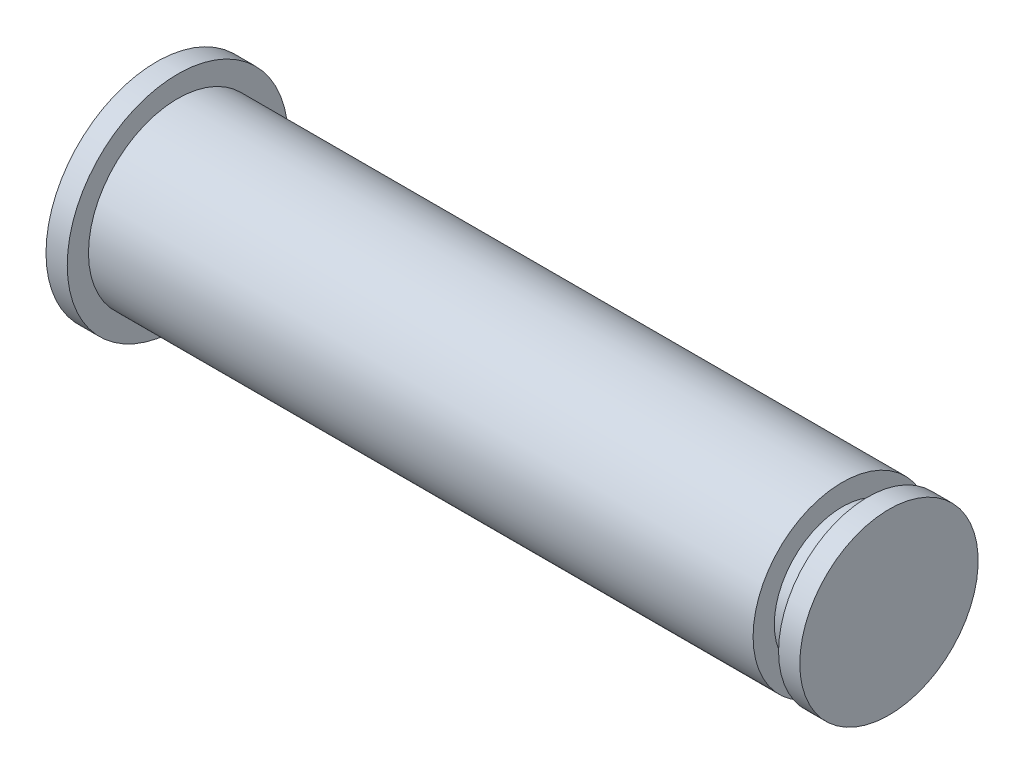
ISO-10303-21;
HEADER;
FILE_DESCRIPTION(('STEP AP214'),'2;1');
FILE_NAME('part.step','',(''),(''),'','','');
FILE_SCHEMA(('AUTOMOTIVE_DESIGN { 1 0 10303 214 1 1 1 1 }'));
ENDSEC;
DATA;
#1=APPLICATION_CONTEXT('core data for automotive mechanical design processes');
#2=APPLICATION_PROTOCOL_DEFINITION('international standard','automotive_design',2000,#1);
#3=PRODUCT_CONTEXT('',#1,'mechanical');
#4=PRODUCT('Part','Part','',(#3));
#5=PRODUCT_RELATED_PRODUCT_CATEGORY('part','',(#4));
#6=PRODUCT_DEFINITION_FORMATION('','',#4);
#7=PRODUCT_DEFINITION_CONTEXT('part definition',#1,'design');
#8=PRODUCT_DEFINITION('design','',#6,#7);
#9=PRODUCT_DEFINITION_SHAPE('','',#8);
#10=(LENGTH_UNIT() NAMED_UNIT(*) SI_UNIT(.MILLI.,.METRE.));
#11=(NAMED_UNIT(*) PLANE_ANGLE_UNIT() SI_UNIT($,.RADIAN.));
#12=(NAMED_UNIT(*) SI_UNIT($,.STERADIAN.) SOLID_ANGLE_UNIT());
#13=UNCERTAINTY_MEASURE_WITH_UNIT(LENGTH_MEASURE(1.E-05),#10,'distance_accuracy_value','');
#14=(GEOMETRIC_REPRESENTATION_CONTEXT(3) GLOBAL_UNCERTAINTY_ASSIGNED_CONTEXT((#13)) GLOBAL_UNIT_ASSIGNED_CONTEXT((#10,
#11,#12)) REPRESENTATION_CONTEXT('',''));
#15=CARTESIAN_POINT('',(0.,0.,0.));
#16=DIRECTION('',(0.,0.,1.));
#17=DIRECTION('',(1.,0.,0.));
#18=AXIS2_PLACEMENT_3D('',#15,#16,#17);
#19=CARTESIAN_POINT('',(0.,0.,0.));
#20=DIRECTION('',(1.,0.,0.));
#21=DIRECTION('',(0.,0.,-1.));
#22=AXIS2_PLACEMENT_3D('',#19,#20,#21);
#23=PLANE('',#22);
#24=CARTESIAN_POINT('',(0.,0.,0.));
#25=DIRECTION('',(-1.,0.,0.));
#26=DIRECTION('',(0.,0.,1.));
#27=AXIS2_PLACEMENT_3D('',#24,#25,#26);
#28=CIRCLE('',#27,5.2);
#29=CARTESIAN_POINT('',(0.,0.,5.2));
#30=VERTEX_POINT('',#29);
#31=EDGE_CURVE('E12',#30,#30,#28,.T.);
#32=ORIENTED_EDGE('',*,*,#31,.T.);
#33=EDGE_LOOP('',(#32));
#34=FACE_BOUND('',#33,.T.);
#35=ADVANCED_FACE('F40',(#34),#23,.F.);
#36=CARTESIAN_POINT('',(0.,0.,0.));
#37=DIRECTION('',(-1.,0.,0.));
#38=DIRECTION('',(0.,0.,1.));
#39=AXIS2_PLACEMENT_3D('',#36,#37,#38);
#40=CYLINDRICAL_SURFACE('',#39,5.2);
#41=ORIENTED_EDGE('',*,*,#31,.F.);
#42=EDGE_LOOP('',(#41));
#43=FACE_BOUND('',#42,.T.);
#44=CARTESIAN_POINT('',(0.999999999999999,0.,0.));
#45=DIRECTION('',(-1.,0.,0.));
#46=DIRECTION('',(0.,0.,1.));
#47=AXIS2_PLACEMENT_3D('',#44,#45,#46);
#48=CIRCLE('',#47,5.2);
#49=CARTESIAN_POINT('',(0.999999999999999,0.,5.2));
#50=VERTEX_POINT('',#49);
#51=EDGE_CURVE('E46',#50,#50,#48,.T.);
#52=ORIENTED_EDGE('',*,*,#51,.T.);
#53=EDGE_LOOP('',(#52));
#54=FACE_BOUND('',#53,.T.);
#55=ADVANCED_FACE('F84',(#43,#54),#40,.T.);
#56=CARTESIAN_POINT('',(1.,5.2,0.));
#57=DIRECTION('',(-1.,0.,0.));
#58=DIRECTION('',(0.,0.,1.));
#59=AXIS2_PLACEMENT_3D('',#56,#57,#58);
#60=PLANE('',#59);
#61=ORIENTED_EDGE('',*,*,#51,.F.);
#62=EDGE_LOOP('',(#61));
#63=FACE_BOUND('',#62,.T.);
#64=CARTESIAN_POINT('',(1.,0.,0.));
#65=DIRECTION('',(-1.,0.,0.));
#66=DIRECTION('',(0.,0.,1.));
#67=AXIS2_PLACEMENT_3D('',#64,#65,#66);
#68=CIRCLE('',#67,4.2);
#69=CARTESIAN_POINT('',(1.,0.,4.2));
#70=VERTEX_POINT('',#69);
#71=EDGE_CURVE('E50',#70,#70,#68,.T.);
#72=ORIENTED_EDGE('',*,*,#71,.T.);
#73=EDGE_LOOP('',(#72));
#74=FACE_BOUND('',#73,.T.);
#75=ADVANCED_FACE('F88',(#63,#74),#60,.F.);
#76=CARTESIAN_POINT('',(0.,0.,0.));
#77=DIRECTION('',(-1.,0.,0.));
#78=DIRECTION('',(0.,0.,1.));
#79=AXIS2_PLACEMENT_3D('',#76,#77,#78);
#80=CYLINDRICAL_SURFACE('',#79,4.2);
#81=ORIENTED_EDGE('',*,*,#71,.F.);
#82=EDGE_LOOP('',(#81));
#83=FACE_BOUND('',#82,.T.);
#84=CARTESIAN_POINT('',(32.3,0.,0.));
#85=DIRECTION('',(-1.,0.,0.));
#86=DIRECTION('',(0.,0.,1.));
#87=AXIS2_PLACEMENT_3D('',#84,#85,#86);
#88=CIRCLE('',#87,4.2);
#89=CARTESIAN_POINT('',(32.3,0.,4.2));
#90=VERTEX_POINT('',#89);
#91=EDGE_CURVE('E54',#90,#90,#88,.T.);
#92=ORIENTED_EDGE('',*,*,#91,.T.);
#93=EDGE_LOOP('',(#92));
#94=FACE_BOUND('',#93,.T.);
#95=ADVANCED_FACE('F93',(#83,#94),#80,.T.);
#96=CARTESIAN_POINT('',(32.3,4.2,0.));
#97=DIRECTION('',(-1.,0.,0.));
#98=DIRECTION('',(0.,0.,1.));
#99=AXIS2_PLACEMENT_3D('',#96,#97,#98);
#100=PLANE('',#99);
#101=ORIENTED_EDGE('',*,*,#91,.F.);
#102=EDGE_LOOP('',(#101));
#103=FACE_BOUND('',#102,.T.);
#104=CARTESIAN_POINT('',(32.3,0.,0.));
#105=DIRECTION('',(-1.,0.,0.));
#106=DIRECTION('',(0.,0.,1.));
#107=AXIS2_PLACEMENT_3D('',#104,#105,#106);
#108=CIRCLE('',#107,3.2);
#109=CARTESIAN_POINT('',(32.3,0.,3.2));
#110=VERTEX_POINT('',#109);
#111=EDGE_CURVE('E59',#110,#110,#108,.T.);
#112=ORIENTED_EDGE('',*,*,#111,.T.);
#113=EDGE_LOOP('',(#112));
#114=FACE_BOUND('',#113,.T.);
#115=ADVANCED_FACE('F99',(#103,#114),#100,.F.);
#116=CARTESIAN_POINT('',(0.,0.,0.));
#117=DIRECTION('',(-1.,0.,0.));
#118=DIRECTION('',(0.,0.,1.));
#119=AXIS2_PLACEMENT_3D('',#116,#117,#118);
#120=CYLINDRICAL_SURFACE('',#119,3.2);
#121=ORIENTED_EDGE('',*,*,#111,.F.);
#122=EDGE_LOOP('',(#121));
#123=FACE_BOUND('',#122,.T.);
#124=CARTESIAN_POINT('',(33.5,0.,0.));
#125=DIRECTION('',(-1.,0.,0.));
#126=DIRECTION('',(0.,0.,1.));
#127=AXIS2_PLACEMENT_3D('',#124,#125,#126);
#128=CIRCLE('',#127,3.2);
#129=CARTESIAN_POINT('',(33.5,0.,3.2));
#130=VERTEX_POINT('',#129);
#131=EDGE_CURVE('E62',#130,#130,#128,.T.);
#132=ORIENTED_EDGE('',*,*,#131,.T.);
#133=EDGE_LOOP('',(#132));
#134=FACE_BOUND('',#133,.T.);
#135=ADVANCED_FACE('F103',(#123,#134),#120,.T.);
#136=CARTESIAN_POINT('',(33.5,4.2,0.));
#137=DIRECTION('',(1.,0.,0.));
#138=DIRECTION('',(0.,0.,-1.));
#139=AXIS2_PLACEMENT_3D('',#136,#137,#138);
#140=PLANE('',#139);
#141=ORIENTED_EDGE('',*,*,#131,.F.);
#142=EDGE_LOOP('',(#141));
#143=FACE_BOUND('',#142,.T.);
#144=CARTESIAN_POINT('',(33.5,0.,0.));
#145=DIRECTION('',(-1.,0.,0.));
#146=DIRECTION('',(0.,0.,1.));
#147=AXIS2_PLACEMENT_3D('',#144,#145,#146);
#148=CIRCLE('',#147,4.2);
#149=CARTESIAN_POINT('',(33.5,0.,4.2));
#150=VERTEX_POINT('',#149);
#151=EDGE_CURVE('E65',#150,#150,#148,.T.);
#152=ORIENTED_EDGE('',*,*,#151,.T.);
#153=EDGE_LOOP('',(#152));
#154=FACE_BOUND('',#153,.T.);
#155=ADVANCED_FACE('F80',(#143,#154),#140,.F.);
#156=CARTESIAN_POINT('',(0.,0.,0.));
#157=DIRECTION('',(-1.,0.,0.));
#158=DIRECTION('',(0.,0.,1.));
#159=AXIS2_PLACEMENT_3D('',#156,#157,#158);
#160=CYLINDRICAL_SURFACE('',#159,4.2);
#161=ORIENTED_EDGE('',*,*,#151,.F.);
#162=EDGE_LOOP('',(#161));
#163=FACE_BOUND('',#162,.T.);
#164=CARTESIAN_POINT('',(34.5,0.,0.));
#165=DIRECTION('',(-1.,0.,0.));
#166=DIRECTION('',(0.,0.,1.));
#167=AXIS2_PLACEMENT_3D('',#164,#165,#166);
#168=CIRCLE('',#167,4.2);
#169=CARTESIAN_POINT('',(34.5,0.,4.2));
#170=VERTEX_POINT('',#169);
#171=EDGE_CURVE('E68',#170,#170,#168,.T.);
#172=ORIENTED_EDGE('',*,*,#171,.T.);
#173=EDGE_LOOP('',(#172));
#174=FACE_BOUND('',#173,.T.);
#175=ADVANCED_FACE('F72',(#163,#174),#160,.T.);
#176=CARTESIAN_POINT('',(34.5,0.,0.));
#177=DIRECTION('',(-1.,0.,0.));
#178=DIRECTION('',(0.,0.,1.));
#179=AXIS2_PLACEMENT_3D('',#176,#177,#178);
#180=PLANE('',#179);
#181=ORIENTED_EDGE('',*,*,#171,.F.);
#182=EDGE_LOOP('',(#181));
#183=FACE_BOUND('',#182,.T.);
#184=ADVANCED_FACE('F74',(#183),#180,.F.);
#185=CLOSED_SHELL('',(#35,#55,#75,#95,#115,#135,#155,#175,#184));
#186=MANIFOLD_SOLID_BREP('B2',#185);
#187=ADVANCED_BREP_SHAPE_REPRESENTATION('',(#18,#186),#14);
#188=SHAPE_DEFINITION_REPRESENTATION(#9,#187);
ENDSEC;
END-ISO-10303-21;
